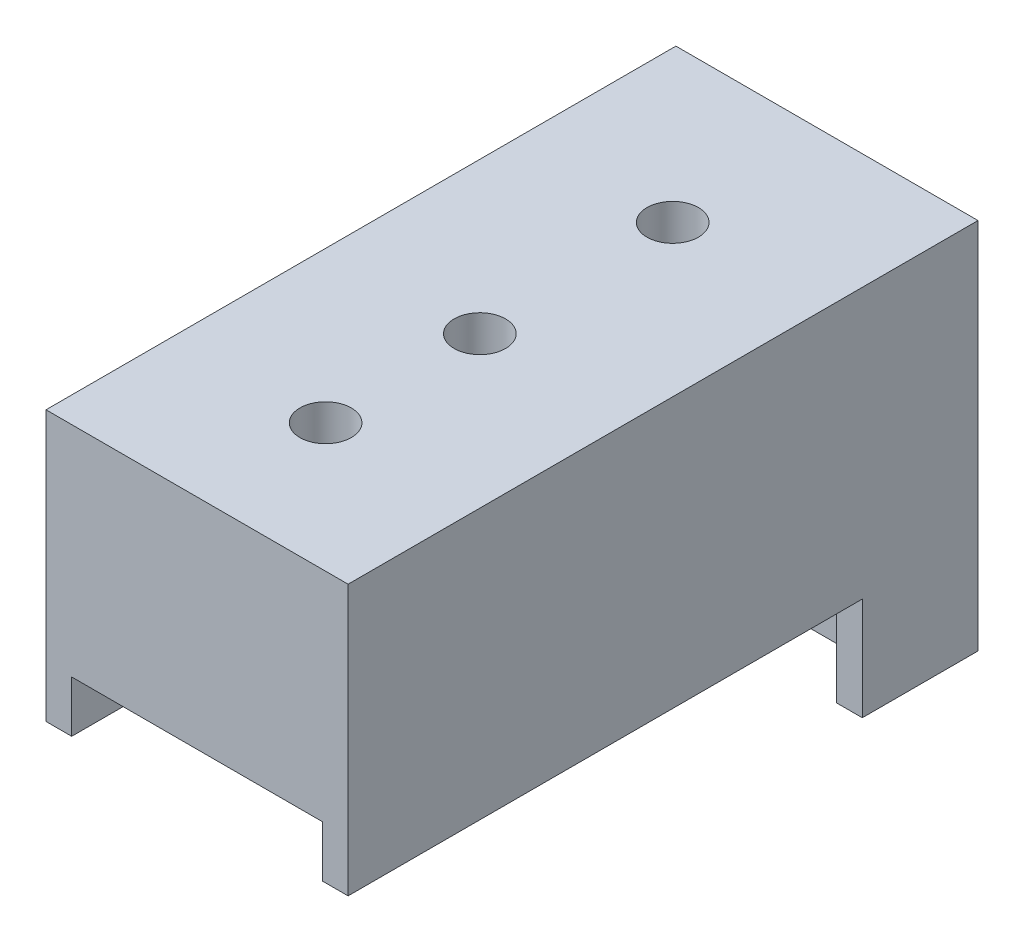
ISO-10303-21;
HEADER;
FILE_DESCRIPTION(('STEP AP214'),'2;1');
FILE_NAME('part.step','',(''),(''),'','','');
FILE_SCHEMA(('AUTOMOTIVE_DESIGN { 1 0 10303 214 1 1 1 1 }'));
ENDSEC;
DATA;
#1=APPLICATION_CONTEXT('core data for automotive mechanical design processes');
#2=APPLICATION_PROTOCOL_DEFINITION('international standard','automotive_design',2000,#1);
#3=PRODUCT_CONTEXT('',#1,'mechanical');
#4=PRODUCT('Part','Part','',(#3));
#5=PRODUCT_RELATED_PRODUCT_CATEGORY('part','',(#4));
#6=PRODUCT_DEFINITION_FORMATION('','',#4);
#7=PRODUCT_DEFINITION_CONTEXT('part definition',#1,'design');
#8=PRODUCT_DEFINITION('design','',#6,#7);
#9=PRODUCT_DEFINITION_SHAPE('','',#8);
#10=(LENGTH_UNIT() NAMED_UNIT(*) SI_UNIT(.MILLI.,.METRE.));
#11=(NAMED_UNIT(*) PLANE_ANGLE_UNIT() SI_UNIT($,.RADIAN.));
#12=(NAMED_UNIT(*) SI_UNIT($,.STERADIAN.) SOLID_ANGLE_UNIT());
#13=UNCERTAINTY_MEASURE_WITH_UNIT(LENGTH_MEASURE(1.E-05),#10,'distance_accuracy_value','');
#14=(GEOMETRIC_REPRESENTATION_CONTEXT(3) GLOBAL_UNCERTAINTY_ASSIGNED_CONTEXT((#13)) GLOBAL_UNIT_ASSIGNED_CONTEXT((#10,
#11,#12)) REPRESENTATION_CONTEXT('',''));
#15=CARTESIAN_POINT('',(0.,0.,0.));
#16=DIRECTION('',(0.,0.,1.));
#17=DIRECTION('',(1.,0.,0.));
#18=AXIS2_PLACEMENT_3D('',#15,#16,#17);
#19=CARTESIAN_POINT('',(9.75,0.,44.));
#20=DIRECTION('',(0.,0.,-1.));
#21=DIRECTION('',(-1.,0.,0.));
#22=AXIS2_PLACEMENT_3D('',#19,#20,#21);
#23=PLANE('',#22);
#24=DIRECTION('',(-1.,0.,0.));
#25=VECTOR('',#24,1.);
#26=CARTESIAN_POINT('',(9.75,17.,44.));
#27=LINE('',#26,#25);
#28=CARTESIAN_POINT('',(11.75,17.,44.));
#29=VERTEX_POINT('',#28);
#30=CARTESIAN_POINT('',(-11.75,17.,44.));
#31=VERTEX_POINT('',#30);
#32=EDGE_CURVE('E142',#29,#31,#27,.T.);
#33=ORIENTED_EDGE('',*,*,#32,.T.);
#34=DIRECTION('',(0.,-1.,0.));
#35=VECTOR('',#34,1.);
#36=CARTESIAN_POINT('',(-11.75,17.,44.));
#37=LINE('',#36,#35);
#38=CARTESIAN_POINT('',(-11.75,-4.,44.));
#39=VERTEX_POINT('',#38);
#40=EDGE_CURVE('E134',#31,#39,#37,.T.);
#41=ORIENTED_EDGE('',*,*,#40,.T.);
#42=DIRECTION('',(1.,0.,0.));
#43=VECTOR('',#42,1.);
#44=CARTESIAN_POINT('',(-11.75,-4.,44.));
#45=LINE('',#44,#43);
#46=CARTESIAN_POINT('',(-9.75,-4.,44.));
#47=VERTEX_POINT('',#46);
#48=EDGE_CURVE('E117',#39,#47,#45,.T.);
#49=ORIENTED_EDGE('',*,*,#48,.T.);
#50=DIRECTION('',(0.,-1.,0.));
#51=VECTOR('',#50,1.);
#52=CARTESIAN_POINT('',(-9.75,17.,44.));
#53=LINE('',#52,#51);
#54=CARTESIAN_POINT('',(-9.75,0.,44.));
#55=VERTEX_POINT('',#54);
#56=EDGE_CURVE('E157',#55,#47,#53,.T.);
#57=ORIENTED_EDGE('',*,*,#56,.F.);
#58=DIRECTION('',(-1.,0.,0.));
#59=VECTOR('',#58,1.);
#60=CARTESIAN_POINT('',(9.75,0.,44.));
#61=LINE('',#60,#59);
#62=CARTESIAN_POINT('',(9.75,0.,44.));
#63=VERTEX_POINT('',#62);
#64=EDGE_CURVE('E11',#63,#55,#61,.T.);
#65=ORIENTED_EDGE('',*,*,#64,.F.);
#66=DIRECTION('',(0.,-1.,0.));
#67=VECTOR('',#66,1.);
#68=CARTESIAN_POINT('',(9.75,17.,44.));
#69=LINE('',#68,#67);
#70=CARTESIAN_POINT('',(9.75,-4.,44.));
#71=VERTEX_POINT('',#70);
#72=EDGE_CURVE('E170',#63,#71,#69,.T.);
#73=ORIENTED_EDGE('',*,*,#72,.T.);
#74=DIRECTION('',(-1.,0.,0.));
#75=VECTOR('',#74,1.);
#76=CARTESIAN_POINT('',(11.75,-4.,44.));
#77=LINE('',#76,#75);
#78=CARTESIAN_POINT('',(11.75,-4.,44.));
#79=VERTEX_POINT('',#78);
#80=EDGE_CURVE('E183',#79,#71,#77,.T.);
#81=ORIENTED_EDGE('',*,*,#80,.F.);
#82=DIRECTION('',(0.,-1.,0.));
#83=VECTOR('',#82,1.);
#84=CARTESIAN_POINT('',(11.75,17.,44.));
#85=LINE('',#84,#83);
#86=EDGE_CURVE('E181',#29,#79,#85,.T.);
#87=ORIENTED_EDGE('',*,*,#86,.F.);
#88=EDGE_LOOP('',(#33,#41,#49,#57,#65,#73,#81,#87));
#89=FACE_BOUND('',#88,.T.);
#90=ADVANCED_FACE('F33',(#89),#23,.F.);
#91=CARTESIAN_POINT('',(9.75,0.,44.));
#92=DIRECTION('',(0.,1.,0.));
#93=DIRECTION('',(0.,0.,1.));
#94=AXIS2_PLACEMENT_3D('',#91,#92,#93);
#95=PLANE('',#94);
#96=CARTESIAN_POINT('',(0.,0.,34.));
#97=DIRECTION('',(0.,-1.,0.));
#98=DIRECTION('',(0.,0.,-1.));
#99=AXIS2_PLACEMENT_3D('',#96,#97,#98);
#100=CIRCLE('',#99,2.);
#101=CARTESIAN_POINT('',(0.,0.,32.));
#102=VERTEX_POINT('',#101);
#103=EDGE_CURVE('E447',#102,#102,#100,.T.);
#104=ORIENTED_EDGE('',*,*,#103,.F.);
#105=EDGE_LOOP('',(#104));
#106=FACE_BOUND('',#105,.T.);
#107=CARTESIAN_POINT('',(0.,0.,22.));
#108=DIRECTION('',(0.,-1.,0.));
#109=DIRECTION('',(0.,0.,-1.));
#110=AXIS2_PLACEMENT_3D('',#107,#108,#109);
#111=CIRCLE('',#110,2.);
#112=CARTESIAN_POINT('',(0.,0.,20.));
#113=VERTEX_POINT('',#112);
#114=EDGE_CURVE('E453',#113,#113,#111,.T.);
#115=ORIENTED_EDGE('',*,*,#114,.F.);
#116=EDGE_LOOP('',(#115));
#117=FACE_BOUND('',#116,.T.);
#118=CARTESIAN_POINT('',(0.,0.,7.));
#119=DIRECTION('',(0.,-1.,0.));
#120=DIRECTION('',(0.,0.,-1.));
#121=AXIS2_PLACEMENT_3D('',#118,#119,#120);
#122=CIRCLE('',#121,2.);
#123=CARTESIAN_POINT('',(0.,0.,5.));
#124=VERTEX_POINT('',#123);
#125=EDGE_CURVE('E442',#124,#124,#122,.T.);
#126=ORIENTED_EDGE('',*,*,#125,.F.);
#127=EDGE_LOOP('',(#126));
#128=FACE_BOUND('',#127,.T.);
#129=DIRECTION('',(0.,0.,-1.));
#130=VECTOR('',#129,1.);
#131=CARTESIAN_POINT('',(-9.75,0.,44.));
#132=LINE('',#131,#130);
#133=CARTESIAN_POINT('',(-9.75,0.,0.));
#134=VERTEX_POINT('',#133);
#135=EDGE_CURVE('E200',#55,#134,#132,.T.);
#136=ORIENTED_EDGE('',*,*,#135,.T.);
#137=DIRECTION('',(-1.,0.,0.));
#138=VECTOR('',#137,1.);
#139=CARTESIAN_POINT('',(9.75,0.,0.));
#140=LINE('',#139,#138);
#141=CARTESIAN_POINT('',(9.75,0.,0.));
#142=VERTEX_POINT('',#141);
#143=EDGE_CURVE('E41',#142,#134,#140,.T.);
#144=ORIENTED_EDGE('',*,*,#143,.F.);
#145=DIRECTION('',(0.,0.,-1.));
#146=VECTOR('',#145,1.);
#147=CARTESIAN_POINT('',(9.75,0.,44.));
#148=LINE('',#147,#146);
#149=EDGE_CURVE('E201',#63,#142,#148,.T.);
#150=ORIENTED_EDGE('',*,*,#149,.F.);
#151=ORIENTED_EDGE('',*,*,#64,.T.);
#152=EDGE_LOOP('',(#136,#144,#150,#151));
#153=FACE_BOUND('',#152,.T.);
#154=ADVANCED_FACE('F224',(#106,#117,#128,#153),#95,.F.);
#155=CARTESIAN_POINT('',(9.75,0.,0.));
#156=DIRECTION('',(0.,0.,-1.));
#157=DIRECTION('',(-1.,0.,0.));
#158=AXIS2_PLACEMENT_3D('',#155,#156,#157);
#159=PLANE('',#158);
#160=CARTESIAN_POINT('',(0.,-7.,0.));
#161=DIRECTION('',(0.,0.,1.));
#162=DIRECTION('',(1.,0.,0.));
#163=AXIS2_PLACEMENT_3D('',#160,#161,#162);
#164=CIRCLE('',#163,1.75);
#165=CARTESIAN_POINT('',(1.75,-7.,0.));
#166=VERTEX_POINT('',#165);
#167=EDGE_CURVE('E440',#166,#166,#164,.T.);
#168=ORIENTED_EDGE('',*,*,#167,.F.);
#169=EDGE_LOOP('',(#168));
#170=FACE_BOUND('',#169,.T.);
#171=DIRECTION('',(0.,-1.,0.));
#172=VECTOR('',#171,1.);
#173=CARTESIAN_POINT('',(-9.75,0.,0.));
#174=LINE('',#173,#172);
#175=CARTESIAN_POINT('',(-9.75,-12.,0.));
#176=VERTEX_POINT('',#175);
#177=EDGE_CURVE('E205',#134,#176,#174,.T.);
#178=ORIENTED_EDGE('',*,*,#177,.T.);
#179=DIRECTION('',(-1.,0.,0.));
#180=VECTOR('',#179,1.);
#181=CARTESIAN_POINT('',(9.75,-12.,0.));
#182=LINE('',#181,#180);
#183=CARTESIAN_POINT('',(9.75,-12.,0.));
#184=VERTEX_POINT('',#183);
#185=EDGE_CURVE('E216',#184,#176,#182,.T.);
#186=ORIENTED_EDGE('',*,*,#185,.F.);
#187=DIRECTION('',(0.,-1.,0.));
#188=VECTOR('',#187,1.);
#189=CARTESIAN_POINT('',(9.75,0.,0.));
#190=LINE('',#189,#188);
#191=EDGE_CURVE('E204',#142,#184,#190,.T.);
#192=ORIENTED_EDGE('',*,*,#191,.F.);
#193=ORIENTED_EDGE('',*,*,#143,.T.);
#194=EDGE_LOOP('',(#178,#186,#192,#193));
#195=FACE_BOUND('',#194,.T.);
#196=ADVANCED_FACE('F219',(#170,#195),#159,.F.);
#197=CARTESIAN_POINT('',(9.75,-12.,-5.));
#198=DIRECTION('',(0.,1.,0.));
#199=DIRECTION('',(0.,0.,1.));
#200=AXIS2_PLACEMENT_3D('',#197,#198,#199);
#201=PLANE('',#200);
#202=ORIENTED_EDGE('',*,*,#185,.T.);
#203=DIRECTION('',(0.,0.,-1.));
#204=VECTOR('',#203,1.);
#205=CARTESIAN_POINT('',(-9.75,-12.,4.));
#206=LINE('',#205,#204);
#207=CARTESIAN_POINT('',(-9.75,-12.,4.));
#208=VERTEX_POINT('',#207);
#209=EDGE_CURVE('E160',#208,#176,#206,.T.);
#210=ORIENTED_EDGE('',*,*,#209,.F.);
#211=DIRECTION('',(1.,0.,0.));
#212=VECTOR('',#211,1.);
#213=CARTESIAN_POINT('',(-11.75,-12.,4.));
#214=LINE('',#213,#212);
#215=CARTESIAN_POINT('',(-11.75,-12.,4.));
#216=VERTEX_POINT('',#215);
#217=EDGE_CURVE('E128',#216,#208,#214,.T.);
#218=ORIENTED_EDGE('',*,*,#217,.F.);
#219=DIRECTION('',(0.,0.,-1.));
#220=VECTOR('',#219,1.);
#221=CARTESIAN_POINT('',(-11.75,-12.,4.));
#222=LINE('',#221,#220);
#223=CARTESIAN_POINT('',(-11.75,-12.,-5.));
#224=VERTEX_POINT('',#223);
#225=EDGE_CURVE('E151',#216,#224,#222,.T.);
#226=ORIENTED_EDGE('',*,*,#225,.T.);
#227=DIRECTION('',(-1.,0.,0.));
#228=VECTOR('',#227,1.);
#229=CARTESIAN_POINT('',(9.75,-12.,-5.));
#230=LINE('',#229,#228);
#231=CARTESIAN_POINT('',(11.75,-12.,-5.));
#232=VERTEX_POINT('',#231);
#233=EDGE_CURVE('E214',#232,#224,#230,.T.);
#234=ORIENTED_EDGE('',*,*,#233,.F.);
#235=DIRECTION('',(0.,0.,-1.));
#236=VECTOR('',#235,1.);
#237=CARTESIAN_POINT('',(11.75,-12.,4.));
#238=LINE('',#237,#236);
#239=CARTESIAN_POINT('',(11.75,-12.,4.));
#240=VERTEX_POINT('',#239);
#241=EDGE_CURVE('E172',#240,#232,#238,.T.);
#242=ORIENTED_EDGE('',*,*,#241,.F.);
#243=DIRECTION('',(-1.,0.,0.));
#244=VECTOR('',#243,1.);
#245=CARTESIAN_POINT('',(11.75,-12.,4.));
#246=LINE('',#245,#244);
#247=CARTESIAN_POINT('',(9.75,-12.,4.));
#248=VERTEX_POINT('',#247);
#249=EDGE_CURVE('E194',#240,#248,#246,.T.);
#250=ORIENTED_EDGE('',*,*,#249,.T.);
#251=DIRECTION('',(0.,0.,-1.));
#252=VECTOR('',#251,1.);
#253=CARTESIAN_POINT('',(9.75,-12.,4.));
#254=LINE('',#253,#252);
#255=EDGE_CURVE('E188',#248,#184,#254,.T.);
#256=ORIENTED_EDGE('',*,*,#255,.T.);
#257=EDGE_LOOP('',(#202,#210,#218,#226,#234,#242,#250,#256));
#258=FACE_BOUND('',#257,.T.);
#259=ADVANCED_FACE('F247',(#258),#201,.F.);
#260=CARTESIAN_POINT('',(9.75,17.,-5.));
#261=DIRECTION('',(0.,0.,1.));
#262=DIRECTION('',(0.,-1.,0.));
#263=AXIS2_PLACEMENT_3D('',#260,#261,#262);
#264=PLANE('',#263);
#265=CARTESIAN_POINT('',(0.,-7.,-5.));
#266=DIRECTION('',(0.,0.,1.));
#267=DIRECTION('',(1.,0.,0.));
#268=AXIS2_PLACEMENT_3D('',#265,#266,#267);
#269=CIRCLE('',#268,1.75);
#270=CARTESIAN_POINT('',(1.75,-7.,-5.));
#271=VERTEX_POINT('',#270);
#272=EDGE_CURVE('E437',#271,#271,#269,.T.);
#273=ORIENTED_EDGE('',*,*,#272,.T.);
#274=EDGE_LOOP('',(#273));
#275=FACE_BOUND('',#274,.T.);
#276=ORIENTED_EDGE('',*,*,#233,.T.);
#277=DIRECTION('',(0.,1.,0.));
#278=VECTOR('',#277,1.);
#279=CARTESIAN_POINT('',(-11.75,17.,-5.));
#280=LINE('',#279,#278);
#281=CARTESIAN_POINT('',(-11.75,17.,-5.));
#282=VERTEX_POINT('',#281);
#283=EDGE_CURVE('E145',#224,#282,#280,.T.);
#284=ORIENTED_EDGE('',*,*,#283,.T.);
#285=DIRECTION('',(-1.,0.,0.));
#286=VECTOR('',#285,1.);
#287=CARTESIAN_POINT('',(9.75,17.,-5.));
#288=LINE('',#287,#286);
#289=CARTESIAN_POINT('',(11.75,17.,-5.));
#290=VERTEX_POINT('',#289);
#291=EDGE_CURVE('E212',#290,#282,#288,.T.);
#292=ORIENTED_EDGE('',*,*,#291,.F.);
#293=DIRECTION('',(0.,1.,0.));
#294=VECTOR('',#293,1.);
#295=CARTESIAN_POINT('',(11.75,17.,-5.));
#296=LINE('',#295,#294);
#297=EDGE_CURVE('E175',#232,#290,#296,.T.);
#298=ORIENTED_EDGE('',*,*,#297,.F.);
#299=EDGE_LOOP('',(#276,#284,#292,#298));
#300=FACE_BOUND('',#299,.T.);
#301=ADVANCED_FACE('F244',(#275,#300),#264,.F.);
#302=CARTESIAN_POINT('',(9.75,17.,44.));
#303=DIRECTION('',(0.,-1.,0.));
#304=DIRECTION('',(0.,0.,-1.));
#305=AXIS2_PLACEMENT_3D('',#302,#303,#304);
#306=PLANE('',#305);
#307=CARTESIAN_POINT('',(0.,17.,34.));
#308=DIRECTION('',(0.,-1.,0.));
#309=DIRECTION('',(0.,0.,-1.));
#310=AXIS2_PLACEMENT_3D('',#307,#308,#309);
#311=CIRCLE('',#310,2.);
#312=CARTESIAN_POINT('',(0.,17.,32.));
#313=VERTEX_POINT('',#312);
#314=EDGE_CURVE('E158',#313,#313,#311,.T.);
#315=ORIENTED_EDGE('',*,*,#314,.T.);
#316=EDGE_LOOP('',(#315));
#317=FACE_BOUND('',#316,.T.);
#318=CARTESIAN_POINT('',(0.,17.,22.));
#319=DIRECTION('',(0.,-1.,0.));
#320=DIRECTION('',(0.,0.,-1.));
#321=AXIS2_PLACEMENT_3D('',#318,#319,#320);
#322=CIRCLE('',#321,2.);
#323=CARTESIAN_POINT('',(0.,17.,20.));
#324=VERTEX_POINT('',#323);
#325=EDGE_CURVE('E450',#324,#324,#322,.T.);
#326=ORIENTED_EDGE('',*,*,#325,.T.);
#327=EDGE_LOOP('',(#326));
#328=FACE_BOUND('',#327,.T.);
#329=CARTESIAN_POINT('',(0.,17.,7.));
#330=DIRECTION('',(0.,-1.,0.));
#331=DIRECTION('',(0.,0.,-1.));
#332=AXIS2_PLACEMENT_3D('',#329,#330,#331);
#333=CIRCLE('',#332,2.);
#334=CARTESIAN_POINT('',(0.,17.,5.));
#335=VERTEX_POINT('',#334);
#336=EDGE_CURVE('E456',#335,#335,#333,.T.);
#337=ORIENTED_EDGE('',*,*,#336,.T.);
#338=EDGE_LOOP('',(#337));
#339=FACE_BOUND('',#338,.T.);
#340=ORIENTED_EDGE('',*,*,#291,.T.);
#341=DIRECTION('',(0.,0.,1.));
#342=VECTOR('',#341,1.);
#343=CARTESIAN_POINT('',(-11.75,17.,44.));
#344=LINE('',#343,#342);
#345=EDGE_CURVE('E143',#282,#31,#344,.T.);
#346=ORIENTED_EDGE('',*,*,#345,.T.);
#347=ORIENTED_EDGE('',*,*,#32,.F.);
#348=DIRECTION('',(0.,0.,1.));
#349=VECTOR('',#348,1.);
#350=CARTESIAN_POINT('',(11.75,17.,44.));
#351=LINE('',#350,#349);
#352=EDGE_CURVE('E178',#290,#29,#351,.T.);
#353=ORIENTED_EDGE('',*,*,#352,.F.);
#354=EDGE_LOOP('',(#340,#346,#347,#353));
#355=FACE_BOUND('',#354,.T.);
#356=ADVANCED_FACE('F241',(#317,#328,#339,#355),#306,.F.);
#357=CARTESIAN_POINT('',(11.75,-4.,44.));
#358=DIRECTION('',(0.,1.,0.));
#359=DIRECTION('',(0.,0.,1.));
#360=AXIS2_PLACEMENT_3D('',#357,#358,#359);
#361=PLANE('',#360);
#362=DIRECTION('',(0.,0.,-1.));
#363=VECTOR('',#362,1.);
#364=CARTESIAN_POINT('',(9.75,-4.,44.));
#365=LINE('',#364,#363);
#366=CARTESIAN_POINT('',(9.75,-4.,4.));
#367=VERTEX_POINT('',#366);
#368=EDGE_CURVE('E127',#71,#367,#365,.T.);
#369=ORIENTED_EDGE('',*,*,#368,.T.);
#370=DIRECTION('',(-1.,0.,0.));
#371=VECTOR('',#370,1.);
#372=CARTESIAN_POINT('',(11.75,-4.,4.));
#373=LINE('',#372,#371);
#374=CARTESIAN_POINT('',(11.75,-4.,4.));
#375=VERTEX_POINT('',#374);
#376=EDGE_CURVE('E197',#375,#367,#373,.T.);
#377=ORIENTED_EDGE('',*,*,#376,.F.);
#378=DIRECTION('',(0.,0.,-1.));
#379=VECTOR('',#378,1.);
#380=CARTESIAN_POINT('',(11.75,-4.,44.));
#381=LINE('',#380,#379);
#382=EDGE_CURVE('E166',#79,#375,#381,.T.);
#383=ORIENTED_EDGE('',*,*,#382,.F.);
#384=ORIENTED_EDGE('',*,*,#80,.T.);
#385=EDGE_LOOP('',(#369,#377,#383,#384));
#386=FACE_BOUND('',#385,.T.);
#387=ADVANCED_FACE('F234',(#386),#361,.F.);
#388=CARTESIAN_POINT('',(11.75,-4.,4.));
#389=DIRECTION('',(0.,0.,-1.));
#390=DIRECTION('',(0.,1.,0.));
#391=AXIS2_PLACEMENT_3D('',#388,#389,#390);
#392=PLANE('',#391);
#393=DIRECTION('',(0.,-1.,0.));
#394=VECTOR('',#393,1.);
#395=CARTESIAN_POINT('',(9.75,-4.,4.));
#396=LINE('',#395,#394);
#397=EDGE_CURVE('E186',#367,#248,#396,.T.);
#398=ORIENTED_EDGE('',*,*,#397,.T.);
#399=ORIENTED_EDGE('',*,*,#249,.F.);
#400=DIRECTION('',(0.,-1.,0.));
#401=VECTOR('',#400,1.);
#402=CARTESIAN_POINT('',(11.75,-4.,4.));
#403=LINE('',#402,#401);
#404=EDGE_CURVE('E169',#375,#240,#403,.T.);
#405=ORIENTED_EDGE('',*,*,#404,.F.);
#406=ORIENTED_EDGE('',*,*,#376,.T.);
#407=EDGE_LOOP('',(#398,#399,#405,#406));
#408=FACE_BOUND('',#407,.T.);
#409=ADVANCED_FACE('F250',(#408),#392,.F.);
#410=CARTESIAN_POINT('',(11.75,0.,0.));
#411=DIRECTION('',(-1.,0.,0.));
#412=DIRECTION('',(0.,0.,1.));
#413=AXIS2_PLACEMENT_3D('',#410,#411,#412);
#414=PLANE('',#413);
#415=ORIENTED_EDGE('',*,*,#382,.T.);
#416=ORIENTED_EDGE('',*,*,#404,.T.);
#417=ORIENTED_EDGE('',*,*,#241,.T.);
#418=ORIENTED_EDGE('',*,*,#297,.T.);
#419=ORIENTED_EDGE('',*,*,#352,.T.);
#420=ORIENTED_EDGE('',*,*,#86,.T.);
#421=EDGE_LOOP('',(#415,#416,#417,#418,#419,#420));
#422=FACE_BOUND('',#421,.T.);
#423=ADVANCED_FACE('F237',(#422),#414,.F.);
#424=CARTESIAN_POINT('',(9.75,0.,0.));
#425=DIRECTION('',(-1.,0.,0.));
#426=DIRECTION('',(0.,0.,1.));
#427=AXIS2_PLACEMENT_3D('',#424,#425,#426);
#428=PLANE('',#427);
#429=ORIENTED_EDGE('',*,*,#72,.F.);
#430=ORIENTED_EDGE('',*,*,#149,.T.);
#431=ORIENTED_EDGE('',*,*,#191,.T.);
#432=ORIENTED_EDGE('',*,*,#255,.F.);
#433=ORIENTED_EDGE('',*,*,#397,.F.);
#434=ORIENTED_EDGE('',*,*,#368,.F.);
#435=EDGE_LOOP('',(#429,#430,#431,#432,#433,#434));
#436=FACE_BOUND('',#435,.T.);
#437=ADVANCED_FACE('F230',(#436),#428,.T.);
#438=CARTESIAN_POINT('',(-9.75,0.,0.));
#439=DIRECTION('',(1.,0.,0.));
#440=DIRECTION('',(0.,0.,1.));
#441=AXIS2_PLACEMENT_3D('',#438,#439,#440);
#442=PLANE('',#441);
#443=ORIENTED_EDGE('',*,*,#177,.F.);
#444=ORIENTED_EDGE('',*,*,#135,.F.);
#445=ORIENTED_EDGE('',*,*,#56,.T.);
#446=DIRECTION('',(0.,0.,-1.));
#447=VECTOR('',#446,1.);
#448=CARTESIAN_POINT('',(-9.75,-4.,44.));
#449=LINE('',#448,#447);
#450=CARTESIAN_POINT('',(-9.75,-4.,4.));
#451=VERTEX_POINT('',#450);
#452=EDGE_CURVE('E123',#47,#451,#449,.T.);
#453=ORIENTED_EDGE('',*,*,#452,.T.);
#454=DIRECTION('',(0.,-1.,0.));
#455=VECTOR('',#454,1.);
#456=CARTESIAN_POINT('',(-9.75,-4.,4.));
#457=LINE('',#456,#455);
#458=EDGE_CURVE('E139',#451,#208,#457,.T.);
#459=ORIENTED_EDGE('',*,*,#458,.T.);
#460=ORIENTED_EDGE('',*,*,#209,.T.);
#461=EDGE_LOOP('',(#443,#444,#445,#453,#459,#460));
#462=FACE_BOUND('',#461,.T.);
#463=ADVANCED_FACE('F222',(#462),#442,.T.);
#464=CARTESIAN_POINT('',(-11.75,-4.,44.));
#465=DIRECTION('',(0.,-1.,0.));
#466=DIRECTION('',(0.,0.,-1.));
#467=AXIS2_PLACEMENT_3D('',#464,#465,#466);
#468=PLANE('',#467);
#469=ORIENTED_EDGE('',*,*,#452,.F.);
#470=ORIENTED_EDGE('',*,*,#48,.F.);
#471=DIRECTION('',(0.,0.,-1.));
#472=VECTOR('',#471,1.);
#473=CARTESIAN_POINT('',(-11.75,-4.,44.));
#474=LINE('',#473,#472);
#475=CARTESIAN_POINT('',(-11.75,-4.,4.));
#476=VERTEX_POINT('',#475);
#477=EDGE_CURVE('E120',#39,#476,#474,.T.);
#478=ORIENTED_EDGE('',*,*,#477,.T.);
#479=DIRECTION('',(1.,0.,0.));
#480=VECTOR('',#479,1.);
#481=CARTESIAN_POINT('',(-11.75,-4.,4.));
#482=LINE('',#481,#480);
#483=EDGE_CURVE('E155',#476,#451,#482,.T.);
#484=ORIENTED_EDGE('',*,*,#483,.T.);
#485=EDGE_LOOP('',(#469,#470,#478,#484));
#486=FACE_BOUND('',#485,.T.);
#487=ADVANCED_FACE('F119',(#486),#468,.T.);
#488=CARTESIAN_POINT('',(-11.75,-4.,4.));
#489=DIRECTION('',(0.,0.,1.));
#490=DIRECTION('',(0.,-1.,0.));
#491=AXIS2_PLACEMENT_3D('',#488,#489,#490);
#492=PLANE('',#491);
#493=ORIENTED_EDGE('',*,*,#458,.F.);
#494=ORIENTED_EDGE('',*,*,#483,.F.);
#495=DIRECTION('',(0.,-1.,0.));
#496=VECTOR('',#495,1.);
#497=CARTESIAN_POINT('',(-11.75,-4.,4.));
#498=LINE('',#497,#496);
#499=EDGE_CURVE('E138',#476,#216,#498,.T.);
#500=ORIENTED_EDGE('',*,*,#499,.T.);
#501=ORIENTED_EDGE('',*,*,#217,.T.);
#502=EDGE_LOOP('',(#493,#494,#500,#501));
#503=FACE_BOUND('',#502,.T.);
#504=ADVANCED_FACE('F253',(#503),#492,.T.);
#505=CARTESIAN_POINT('',(-11.75,0.,0.));
#506=DIRECTION('',(1.,0.,0.));
#507=DIRECTION('',(0.,0.,1.));
#508=AXIS2_PLACEMENT_3D('',#505,#506,#507);
#509=PLANE('',#508);
#510=ORIENTED_EDGE('',*,*,#477,.F.);
#511=ORIENTED_EDGE('',*,*,#40,.F.);
#512=ORIENTED_EDGE('',*,*,#345,.F.);
#513=ORIENTED_EDGE('',*,*,#283,.F.);
#514=ORIENTED_EDGE('',*,*,#225,.F.);
#515=ORIENTED_EDGE('',*,*,#499,.F.);
#516=EDGE_LOOP('',(#510,#511,#512,#513,#514,#515));
#517=FACE_BOUND('',#516,.T.);
#518=ADVANCED_FACE('F132',(#517),#509,.F.);
#519=CARTESIAN_POINT('',(0.,17.,7.));
#520=DIRECTION('',(0.,-1.,0.));
#521=DIRECTION('',(0.,0.,-1.));
#522=AXIS2_PLACEMENT_3D('',#519,#520,#521);
#523=CYLINDRICAL_SURFACE('',#522,2.);
#524=ORIENTED_EDGE('',*,*,#336,.F.);
#525=EDGE_LOOP('',(#524));
#526=FACE_BOUND('',#525,.T.);
#527=ORIENTED_EDGE('',*,*,#125,.T.);
#528=EDGE_LOOP('',(#527));
#529=FACE_BOUND('',#528,.T.);
#530=ADVANCED_FACE('F260',(#526,#529),#523,.F.);
#531=CARTESIAN_POINT('',(0.,17.,22.));
#532=DIRECTION('',(0.,-1.,0.));
#533=DIRECTION('',(0.,0.,-1.));
#534=AXIS2_PLACEMENT_3D('',#531,#532,#533);
#535=CYLINDRICAL_SURFACE('',#534,2.);
#536=ORIENTED_EDGE('',*,*,#325,.F.);
#537=EDGE_LOOP('',(#536));
#538=FACE_BOUND('',#537,.T.);
#539=ORIENTED_EDGE('',*,*,#114,.T.);
#540=EDGE_LOOP('',(#539));
#541=FACE_BOUND('',#540,.T.);
#542=ADVANCED_FACE('F329',(#538,#541),#535,.F.);
#543=CARTESIAN_POINT('',(0.,17.,34.));
#544=DIRECTION('',(0.,-1.,0.));
#545=DIRECTION('',(0.,0.,-1.));
#546=AXIS2_PLACEMENT_3D('',#543,#544,#545);
#547=CYLINDRICAL_SURFACE('',#546,2.);
#548=ORIENTED_EDGE('',*,*,#314,.F.);
#549=EDGE_LOOP('',(#548));
#550=FACE_BOUND('',#549,.T.);
#551=ORIENTED_EDGE('',*,*,#103,.T.);
#552=EDGE_LOOP('',(#551));
#553=FACE_BOUND('',#552,.T.);
#554=ADVANCED_FACE('F336',(#550,#553),#547,.F.);
#555=CARTESIAN_POINT('',(0.,-7.,-5.));
#556=DIRECTION('',(0.,0.,1.));
#557=DIRECTION('',(1.,0.,0.));
#558=AXIS2_PLACEMENT_3D('',#555,#556,#557);
#559=CYLINDRICAL_SURFACE('',#558,1.75);
#560=CARTESIAN_POINT('',(1.75,-7.,-5.));
#561=CARTESIAN_POINT('',(1.75,-7.,-4.94791666666667));
#562=CARTESIAN_POINT('',(1.75,-7.,-4.89583333333334));
#563=CARTESIAN_POINT('',(1.75,-7.,-4.79166666666667));
#564=CARTESIAN_POINT('',(1.75,-7.,-4.73958333333334));
#565=CARTESIAN_POINT('',(1.75,-7.,-4.63541666666667));
#566=CARTESIAN_POINT('',(1.75,-7.,-4.58333333333334));
#567=CARTESIAN_POINT('',(1.75,-7.,-4.47916666666667));
#568=CARTESIAN_POINT('',(1.75,-7.,-4.42708333333334));
#569=CARTESIAN_POINT('',(1.75,-7.,-4.32291666666667));
#570=CARTESIAN_POINT('',(1.75,-7.,-4.27083333333334));
#571=CARTESIAN_POINT('',(1.75,-7.,-4.16666666666667));
#572=CARTESIAN_POINT('',(1.75,-7.,-4.11458333333334));
#573=CARTESIAN_POINT('',(1.75,-7.,-4.01041666666667));
#574=CARTESIAN_POINT('',(1.75,-7.,-3.95833333333334));
#575=CARTESIAN_POINT('',(1.75,-7.,-3.85416666666667));
#576=CARTESIAN_POINT('',(1.75,-7.,-3.80208333333333));
#577=CARTESIAN_POINT('',(1.75,-7.,-3.69791666666667));
#578=CARTESIAN_POINT('',(1.75,-7.,-3.64583333333333));
#579=CARTESIAN_POINT('',(1.75,-7.,-3.54166666666667));
#580=CARTESIAN_POINT('',(1.75,-7.,-3.48958333333333));
#581=CARTESIAN_POINT('',(1.75,-7.,-3.38541666666667));
#582=CARTESIAN_POINT('',(1.75,-7.,-3.33333333333333));
#583=CARTESIAN_POINT('',(1.75,-7.,-3.22916666666667));
#584=CARTESIAN_POINT('',(1.75,-7.,-3.17708333333333));
#585=CARTESIAN_POINT('',(1.75,-7.,-3.07291666666667));
#586=CARTESIAN_POINT('',(1.75,-7.,-3.02083333333333));
#587=CARTESIAN_POINT('',(1.75,-7.,-2.91666666666667));
#588=CARTESIAN_POINT('',(1.75,-7.,-2.86458333333333));
#589=CARTESIAN_POINT('',(1.75,-7.,-2.76041666666667));
#590=CARTESIAN_POINT('',(1.75,-7.,-2.70833333333333));
#591=CARTESIAN_POINT('',(1.75,-7.,-2.60416666666667));
#592=CARTESIAN_POINT('',(1.75,-7.,-2.55208333333333));
#593=CARTESIAN_POINT('',(1.75,-7.,-2.44791666666667));
#594=CARTESIAN_POINT('',(1.75,-7.,-2.39583333333333));
#595=CARTESIAN_POINT('',(1.75,-7.,-2.29166666666667));
#596=CARTESIAN_POINT('',(1.75,-7.,-2.23958333333333));
#597=CARTESIAN_POINT('',(1.75,-7.,-2.13541666666667));
#598=CARTESIAN_POINT('',(1.75,-7.,-2.08333333333333));
#599=CARTESIAN_POINT('',(1.75,-7.,-1.97916666666667));
#600=CARTESIAN_POINT('',(1.75,-7.,-1.92708333333333));
#601=CARTESIAN_POINT('',(1.75,-7.,-1.82291666666667));
#602=CARTESIAN_POINT('',(1.75,-7.,-1.77083333333333));
#603=CARTESIAN_POINT('',(1.75,-7.,-1.66666666666667));
#604=CARTESIAN_POINT('',(1.75,-7.,-1.61458333333333));
#605=CARTESIAN_POINT('',(1.75,-7.,-1.51041666666667));
#606=CARTESIAN_POINT('',(1.75,-7.,-1.45833333333333));
#607=CARTESIAN_POINT('',(1.75,-7.,-1.35416666666667));
#608=CARTESIAN_POINT('',(1.75,-7.,-1.30208333333333));
#609=CARTESIAN_POINT('',(1.75,-7.,-1.19791666666667));
#610=CARTESIAN_POINT('',(1.75,-7.,-1.14583333333333));
#611=CARTESIAN_POINT('',(1.75,-7.,-1.04166666666667));
#612=CARTESIAN_POINT('',(1.75,-7.,-0.989583333333334));
#613=CARTESIAN_POINT('',(1.75,-7.,-0.885416666666668));
#614=CARTESIAN_POINT('',(1.75,-7.,-0.833333333333334));
#615=CARTESIAN_POINT('',(1.75,-7.,-0.729166666666667));
#616=CARTESIAN_POINT('',(1.75,-7.,-0.677083333333334));
#617=CARTESIAN_POINT('',(1.75,-7.,-0.572916666666667));
#618=CARTESIAN_POINT('',(1.75,-7.,-0.520833333333334));
#619=CARTESIAN_POINT('',(1.75,-7.,-0.416666666666667));
#620=CARTESIAN_POINT('',(1.75,-7.,-0.364583333333334));
#621=CARTESIAN_POINT('',(1.75,-7.,-0.260416666666667));
#622=CARTESIAN_POINT('',(1.75,-7.,-0.208333333333333));
#623=CARTESIAN_POINT('',(1.75,-7.,-0.104166666666667));
#624=CARTESIAN_POINT('',(1.75,-7.,-0.0520833333333334));
#625=CARTESIAN_POINT('',(1.75,-7.,0.));
#626=B_SPLINE_CURVE_WITH_KNOTS('',3,(#560,#561,#562,#563,#564,#565,#566,#567,#568,#569,#570,
#571,#572,#573,#574,#575,#576,#577,#578,#579,#580,#581,#582,#583,#584,#585,#586,#587,#588,#589,
#590,#591,#592,#593,#594,#595,#596,#597,#598,#599,#600,#601,#602,#603,#604,#605,#606,#607,#608,
#609,#610,#611,#612,#613,#614,#615,#616,#617,#618,#619,#620,#621,#622,#623,#624,#625),
.UNSPECIFIED.,.F.,.F.,(4,2,2,2,2,2,2,2,2,2,2,2,2,2,2,2,2,2,2,2,2,2,2,2,2,2,2,2,2,2,2,2,4),(0.,
0.15625,0.3125,0.46875,0.625000000000001,0.781250000000001,0.937500000000001,1.09375,1.25,
1.40625,1.5625,1.71875,1.875,2.03125,2.1875,2.34375,2.5,2.65625,2.8125,2.96875,3.125,3.28125,
3.4375,3.59375,3.75,3.90625,4.0625,4.21875,4.375,4.53125,4.6875,4.84375,5.),.UNSPECIFIED.);
#627=EDGE_CURVE('BSEAM344',#271,#166,#626,.T.);
#628=ORIENTED_EDGE('',*,*,#272,.F.);
#629=ORIENTED_EDGE('',*,*,#167,.T.);
#630=ORIENTED_EDGE('',*,*,#627,.T.);
#631=ORIENTED_EDGE('',*,*,#627,.F.);
#632=EDGE_LOOP('',(#628,#630,#629,#631));
#633=FACE_BOUND('',#632,.T.);
#634=ADVANCED_FACE('F344',(#633),#559,.F.);
#635=CLOSED_SHELL('',(#90,#154,#196,#259,#301,#356,#387,#409,#423,#437,#463,#487,#504,#518,#530,
#542,#554,#634));
#636=MANIFOLD_SOLID_BREP('B2',#635);
#637=ADVANCED_BREP_SHAPE_REPRESENTATION('',(#18,#636),#14);
#638=SHAPE_DEFINITION_REPRESENTATION(#9,#637);
ENDSEC;
END-ISO-10303-21;
